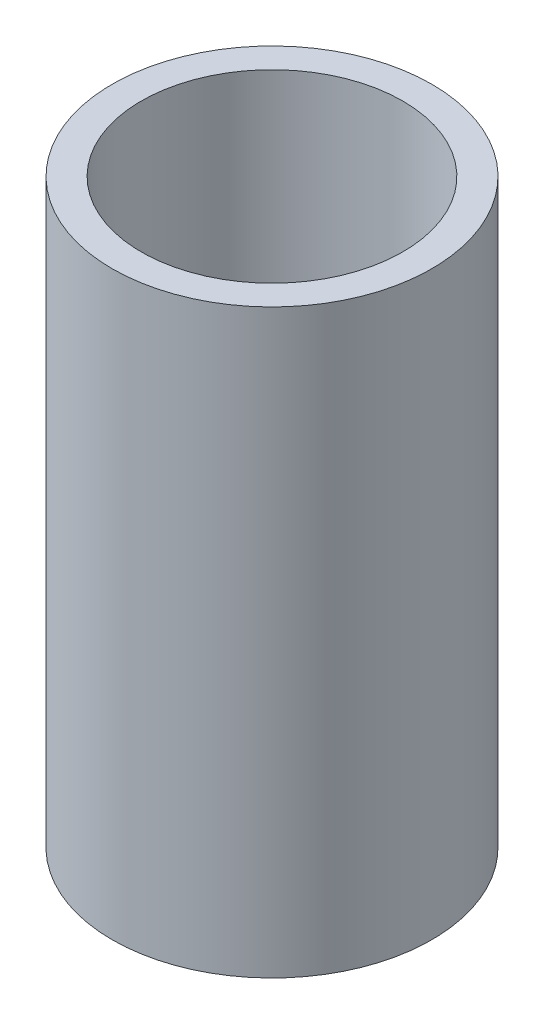
ISO-10303-21;
HEADER;
FILE_DESCRIPTION(('STEP AP214'),'2;1');
FILE_NAME('part.step','',(''),(''),'','','');
FILE_SCHEMA(('AUTOMOTIVE_DESIGN { 1 0 10303 214 1 1 1 1 }'));
ENDSEC;
DATA;
#1=APPLICATION_CONTEXT('core data for automotive mechanical design processes');
#2=APPLICATION_PROTOCOL_DEFINITION('international standard','automotive_design',2000,#1);
#3=PRODUCT_CONTEXT('',#1,'mechanical');
#4=PRODUCT('Part','Part','',(#3));
#5=PRODUCT_RELATED_PRODUCT_CATEGORY('part','',(#4));
#6=PRODUCT_DEFINITION_FORMATION('','',#4);
#7=PRODUCT_DEFINITION_CONTEXT('part definition',#1,'design');
#8=PRODUCT_DEFINITION('design','',#6,#7);
#9=PRODUCT_DEFINITION_SHAPE('','',#8);
#10=(LENGTH_UNIT() NAMED_UNIT(*) SI_UNIT(.MILLI.,.METRE.));
#11=(NAMED_UNIT(*) PLANE_ANGLE_UNIT() SI_UNIT($,.RADIAN.));
#12=(NAMED_UNIT(*) SI_UNIT($,.STERADIAN.) SOLID_ANGLE_UNIT());
#13=UNCERTAINTY_MEASURE_WITH_UNIT(LENGTH_MEASURE(1.E-05),#10,'distance_accuracy_value','');
#14=(GEOMETRIC_REPRESENTATION_CONTEXT(3) GLOBAL_UNCERTAINTY_ASSIGNED_CONTEXT((#13)) GLOBAL_UNIT_ASSIGNED_CONTEXT((#10,
#11,#12)) REPRESENTATION_CONTEXT('',''));
#15=CARTESIAN_POINT('',(0.,0.,0.));
#16=DIRECTION('',(0.,0.,1.));
#17=DIRECTION('',(1.,0.,0.));
#18=AXIS2_PLACEMENT_3D('',#15,#16,#17);
#19=CARTESIAN_POINT('',(44.9999999999999,-80.,0.));
#20=DIRECTION('',(0.,-1.,0.));
#21=DIRECTION('',(0.,0.,-1.));
#22=AXIS2_PLACEMENT_3D('',#19,#20,#21);
#23=PLANE('',#22);
#24=CARTESIAN_POINT('',(0.,-80.,0.));
#25=DIRECTION('',(0.,-1.,0.));
#26=DIRECTION('',(0.,0.,-1.));
#27=AXIS2_PLACEMENT_3D('',#24,#25,#26);
#28=CIRCLE('',#27,54.9999999999999);
#29=CARTESIAN_POINT('',(0.,-80.,-54.9999999999999));
#30=VERTEX_POINT('',#29);
#31=EDGE_CURVE('E53',#30,#30,#28,.T.);
#32=ORIENTED_EDGE('',*,*,#31,.T.);
#33=EDGE_LOOP('',(#32));
#34=FACE_BOUND('',#33,.T.);
#35=CARTESIAN_POINT('',(0.,-80.,0.));
#36=DIRECTION('',(0.,-1.,0.));
#37=DIRECTION('',(0.,0.,-1.));
#38=AXIS2_PLACEMENT_3D('',#35,#36,#37);
#39=CIRCLE('',#38,44.9999999999999);
#40=CARTESIAN_POINT('',(0.,-80.,-44.9999999999999));
#41=VERTEX_POINT('',#40);
#42=EDGE_CURVE('E11',#41,#41,#39,.F.);
#43=ORIENTED_EDGE('',*,*,#42,.T.);
#44=EDGE_LOOP('',(#43));
#45=FACE_BOUND('',#44,.T.);
#46=ADVANCED_FACE('F49',(#34,#45),#23,.T.);
#47=OPEN_SHELL('',(#46));
#48=SHELL_BASED_SURFACE_MODEL('B2',(#47));
#49=CARTESIAN_POINT('',(0.,-110.603092707212,0.));
#50=DIRECTION('',(0.,-1.,0.));
#51=DIRECTION('',(0.,0.,-1.));
#52=AXIS2_PLACEMENT_3D('',#49,#50,#51);
#53=CYLINDRICAL_SURFACE('',#52,44.9999999999999);
#54=CARTESIAN_POINT('',(0.,-100.,0.));
#55=DIRECTION('',(0.,-1.,0.));
#56=DIRECTION('',(0.,0.,-1.));
#57=AXIS2_PLACEMENT_3D('',#54,#55,#56);
#58=CIRCLE('',#57,44.9999999999999);
#59=CARTESIAN_POINT('',(0.,-100.,-44.9999999999999));
#60=VERTEX_POINT('',#59);
#61=EDGE_CURVE('E48',#60,#60,#58,.T.);
#62=ORIENTED_EDGE('',*,*,#61,.T.);
#63=EDGE_LOOP('',(#62));
#64=FACE_BOUND('',#63,.T.);
#65=CARTESIAN_POINT('',(0.,100.,0.));
#66=DIRECTION('',(0.,-1.,0.));
#67=DIRECTION('',(0.,0.,-1.));
#68=AXIS2_PLACEMENT_3D('',#65,#66,#67);
#69=CIRCLE('',#68,44.9999999999999);
#70=CARTESIAN_POINT('',(0.,100.,-44.9999999999999));
#71=VERTEX_POINT('',#70);
#72=EDGE_CURVE('E88',#71,#71,#69,.T.);
#73=ORIENTED_EDGE('',*,*,#72,.F.);
#74=EDGE_LOOP('',(#73));
#75=FACE_BOUND('',#74,.T.);
#76=ADVANCED_FACE('F74',(#64,#75),#53,.F.);
#77=CARTESIAN_POINT('',(44.9999999999999,-100.,0.));
#78=DIRECTION('',(0.,-1.,0.));
#79=DIRECTION('',(0.,0.,-1.));
#80=AXIS2_PLACEMENT_3D('',#77,#78,#79);
#81=PLANE('',#80);
#82=CARTESIAN_POINT('',(0.,-100.,0.));
#83=DIRECTION('',(0.,-1.,0.));
#84=DIRECTION('',(0.,0.,-1.));
#85=AXIS2_PLACEMENT_3D('',#82,#83,#84);
#86=CIRCLE('',#85,54.9999999999999);
#87=CARTESIAN_POINT('',(0.,-100.,-54.9999999999999));
#88=VERTEX_POINT('',#87);
#89=EDGE_CURVE('E80',#88,#88,#86,.T.);
#90=ORIENTED_EDGE('',*,*,#89,.T.);
#91=EDGE_LOOP('',(#90));
#92=FACE_BOUND('',#91,.T.);
#93=ORIENTED_EDGE('',*,*,#61,.F.);
#94=EDGE_LOOP('',(#93));
#95=FACE_BOUND('',#94,.T.);
#96=ADVANCED_FACE('F98',(#92,#95),#81,.T.);
#97=CARTESIAN_POINT('',(0.,-110.603092707212,0.));
#98=DIRECTION('',(0.,-1.,0.));
#99=DIRECTION('',(0.,0.,-1.));
#100=AXIS2_PLACEMENT_3D('',#97,#98,#99);
#101=CYLINDRICAL_SURFACE('',#100,54.9999999999999);
#102=CARTESIAN_POINT('',(0.,100.,0.));
#103=DIRECTION('',(0.,-1.,0.));
#104=DIRECTION('',(0.,0.,-1.));
#105=AXIS2_PLACEMENT_3D('',#102,#103,#104);
#106=CIRCLE('',#105,54.9999999999999);
#107=CARTESIAN_POINT('',(0.,100.,-54.9999999999999));
#108=VERTEX_POINT('',#107);
#109=EDGE_CURVE('E84',#108,#108,#106,.T.);
#110=ORIENTED_EDGE('',*,*,#109,.T.);
#111=EDGE_LOOP('',(#110));
#112=FACE_BOUND('',#111,.T.);
#113=ORIENTED_EDGE('',*,*,#89,.F.);
#114=EDGE_LOOP('',(#113));
#115=FACE_BOUND('',#114,.T.);
#116=ADVANCED_FACE('F103',(#112,#115),#101,.T.);
#117=CARTESIAN_POINT('',(44.9999999999999,100.,0.));
#118=DIRECTION('',(0.,1.,0.));
#119=DIRECTION('',(0.,0.,1.));
#120=AXIS2_PLACEMENT_3D('',#117,#118,#119);
#121=PLANE('',#120);
#122=ORIENTED_EDGE('',*,*,#72,.T.);
#123=EDGE_LOOP('',(#122));
#124=FACE_BOUND('',#123,.T.);
#125=ORIENTED_EDGE('',*,*,#109,.F.);
#126=EDGE_LOOP('',(#125));
#127=FACE_BOUND('',#126,.T.);
#128=ADVANCED_FACE('F94',(#124,#127),#121,.T.);
#129=CLOSED_SHELL('',(#76,#96,#116,#128));
#130=MANIFOLD_SOLID_BREP('B6',#129);
#131=ADVANCED_BREP_SHAPE_REPRESENTATION('',(#18,#130),#14);
#132=MANIFOLD_SURFACE_SHAPE_REPRESENTATION('',(#18,#48),#14);
#133=SHAPE_REPRESENTATION('',(#18),#14);
#134=SHAPE_DEFINITION_REPRESENTATION(#9,#133);
#135=SHAPE_REPRESENTATION_RELATIONSHIP('','',#133,#131);
#136=SHAPE_REPRESENTATION_RELATIONSHIP('','',#133,#132);
ENDSEC;
END-ISO-10303-21;
